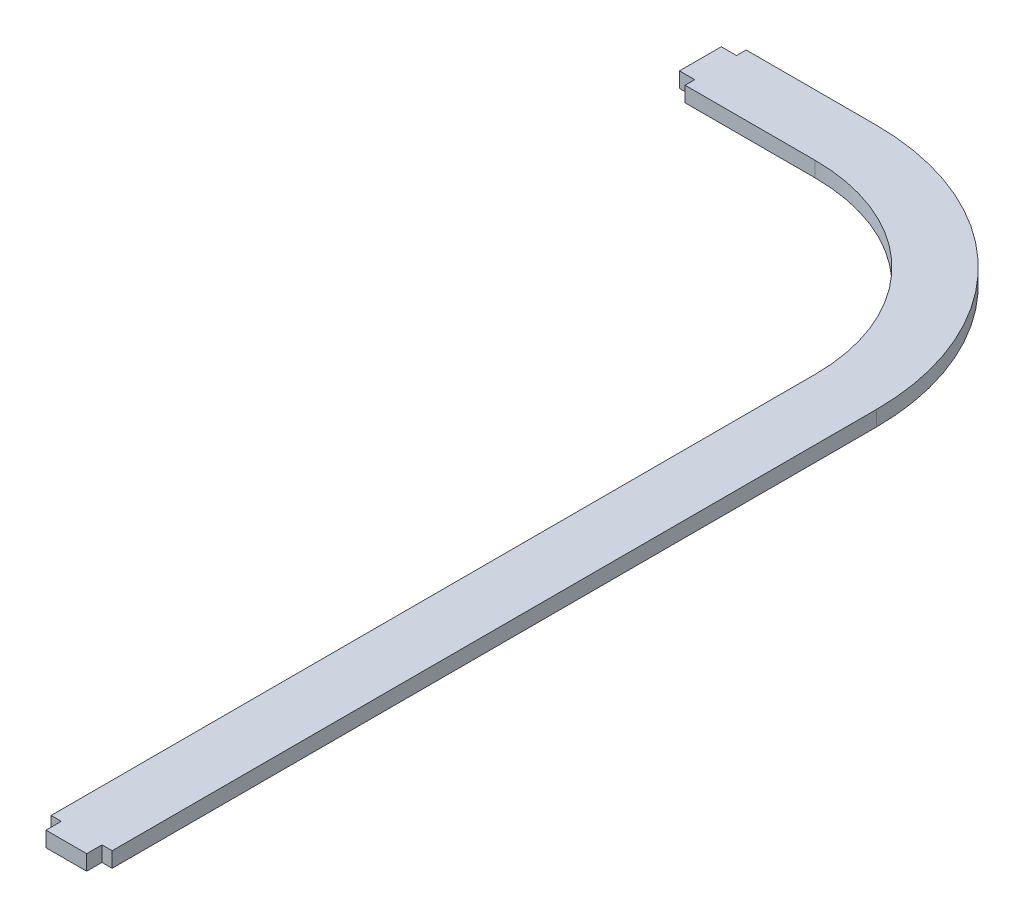
ISO-10303-21;
HEADER;
FILE_DESCRIPTION(('STEP AP214'),'2;1');
FILE_NAME('part.step','',(''),(''),'','','');
FILE_SCHEMA(('AUTOMOTIVE_DESIGN { 1 0 10303 214 1 1 1 1 }'));
ENDSEC;
DATA;
#1=APPLICATION_CONTEXT('core data for automotive mechanical design processes');
#2=APPLICATION_PROTOCOL_DEFINITION('international standard','automotive_design',2000,#1);
#3=PRODUCT_CONTEXT('',#1,'mechanical');
#4=PRODUCT('Part','Part','',(#3));
#5=PRODUCT_RELATED_PRODUCT_CATEGORY('part','',(#4));
#6=PRODUCT_DEFINITION_FORMATION('','',#4);
#7=PRODUCT_DEFINITION_CONTEXT('part definition',#1,'design');
#8=PRODUCT_DEFINITION('design','',#6,#7);
#9=PRODUCT_DEFINITION_SHAPE('','',#8);
#10=(LENGTH_UNIT() NAMED_UNIT(*) SI_UNIT(.MILLI.,.METRE.));
#11=(NAMED_UNIT(*) PLANE_ANGLE_UNIT() SI_UNIT($,.RADIAN.));
#12=(NAMED_UNIT(*) SI_UNIT($,.STERADIAN.) SOLID_ANGLE_UNIT());
#13=UNCERTAINTY_MEASURE_WITH_UNIT(LENGTH_MEASURE(1.E-05),#10,'distance_accuracy_value','');
#14=(GEOMETRIC_REPRESENTATION_CONTEXT(3) GLOBAL_UNCERTAINTY_ASSIGNED_CONTEXT((#13)) GLOBAL_UNIT_ASSIGNED_CONTEXT((#10,
#11,#12)) REPRESENTATION_CONTEXT('',''));
#15=CARTESIAN_POINT('',(0.,0.,0.));
#16=DIRECTION('',(0.,0.,1.));
#17=DIRECTION('',(1.,0.,0.));
#18=AXIS2_PLACEMENT_3D('',#15,#16,#17);
#19=CARTESIAN_POINT('',(77.,3.,0.));
#20=DIRECTION('',(-1.,0.,0.));
#21=DIRECTION('',(0.,0.,1.));
#22=AXIS2_PLACEMENT_3D('',#19,#20,#21);
#23=PLANE('',#22);
#24=DIRECTION('',(0.,0.,-1.));
#25=VECTOR('',#24,1.);
#26=CARTESIAN_POINT('',(77.,0.,0.));
#27=LINE('',#26,#25);
#28=CARTESIAN_POINT('',(77.,0.,188.736951871658));
#29=VERTEX_POINT('',#28);
#30=CARTESIAN_POINT('',(77.,0.,38.5333587428506));
#31=VERTEX_POINT('',#30);
#32=EDGE_CURVE('E180',#29,#31,#27,.T.);
#33=ORIENTED_EDGE('',*,*,#32,.T.);
#34=DIRECTION('',(0.,-1.,0.));
#35=VECTOR('',#34,1.);
#36=CARTESIAN_POINT('',(77.,3.,38.5333587428506));
#37=LINE('',#36,#35);
#38=CARTESIAN_POINT('',(77.,3.,38.5333587428506));
#39=VERTEX_POINT('',#38);
#40=EDGE_CURVE('E11',#39,#31,#37,.T.);
#41=ORIENTED_EDGE('',*,*,#40,.F.);
#42=DIRECTION('',(0.,0.,-1.));
#43=VECTOR('',#42,1.);
#44=CARTESIAN_POINT('',(77.,3.,0.));
#45=LINE('',#44,#43);
#46=CARTESIAN_POINT('',(77.,3.,188.736951871658));
#47=VERTEX_POINT('',#46);
#48=EDGE_CURVE('E222',#47,#39,#45,.T.);
#49=ORIENTED_EDGE('',*,*,#48,.F.);
#50=DIRECTION('',(0.,-1.,0.));
#51=VECTOR('',#50,1.);
#52=CARTESIAN_POINT('',(77.,3.,188.736951871658));
#53=LINE('',#52,#51);
#54=EDGE_CURVE('E179',#47,#29,#53,.T.);
#55=ORIENTED_EDGE('',*,*,#54,.T.);
#56=EDGE_LOOP('',(#33,#41,#49,#55));
#57=FACE_BOUND('',#56,.T.);
#58=ADVANCED_FACE('F35',(#57),#23,.F.);
#59=CARTESIAN_POINT('',(28.5735931288072,3.,38.5333587428506));
#60=DIRECTION('',(0.,-1.,0.));
#61=DIRECTION('',(0.,0.,-1.));
#62=AXIS2_PLACEMENT_3D('',#59,#60,#61);
#63=CYLINDRICAL_SURFACE('',#62,48.4264068711928);
#64=CARTESIAN_POINT('',(28.5735931288072,0.,38.5333587428506));
#65=DIRECTION('',(0.,1.,0.));
#66=DIRECTION('',(0.,0.,1.));
#67=AXIS2_PLACEMENT_3D('',#64,#65,#66);
#68=CIRCLE('',#67,48.4264068711928);
#69=CARTESIAN_POINT('',(28.5735931288072,0.,-9.89304812834225));
#70=VERTEX_POINT('',#69);
#71=EDGE_CURVE('E183',#31,#70,#68,.T.);
#72=ORIENTED_EDGE('',*,*,#71,.T.);
#73=DIRECTION('',(0.,-1.,0.));
#74=VECTOR('',#73,1.);
#75=CARTESIAN_POINT('',(28.5735931288072,3.,-9.89304812834225));
#76=LINE('',#75,#74);
#77=CARTESIAN_POINT('',(28.5735931288072,3.,-9.89304812834225));
#78=VERTEX_POINT('',#77);
#79=EDGE_CURVE('E43',#78,#70,#76,.T.);
#80=ORIENTED_EDGE('',*,*,#79,.F.);
#81=CARTESIAN_POINT('',(28.5735931288072,3.,38.5333587428506));
#82=DIRECTION('',(0.,1.,0.));
#83=DIRECTION('',(0.,0.,1.));
#84=AXIS2_PLACEMENT_3D('',#81,#82,#83);
#85=CIRCLE('',#84,48.4264068711928);
#86=EDGE_CURVE('E117',#39,#78,#85,.T.);
#87=ORIENTED_EDGE('',*,*,#86,.F.);
#88=ORIENTED_EDGE('',*,*,#40,.T.);
#89=EDGE_LOOP('',(#72,#80,#87,#88));
#90=FACE_BOUND('',#89,.T.);
#91=ADVANCED_FACE('F251',(#90),#63,.T.);
#92=CARTESIAN_POINT('',(0.,3.,-9.89304812834225));
#93=DIRECTION('',(0.,0.,-1.));
#94=DIRECTION('',(-1.,0.,0.));
#95=AXIS2_PLACEMENT_3D('',#92,#93,#94);
#96=PLANE('',#95);
#97=DIRECTION('',(1.,0.,0.));
#98=VECTOR('',#97,1.);
#99=CARTESIAN_POINT('',(0.,0.,-9.89304812834225));
#100=LINE('',#99,#98);
#101=CARTESIAN_POINT('',(3.,0.,-9.89304812834225));
#102=VERTEX_POINT('',#101);
#103=EDGE_CURVE('E186',#102,#70,#100,.T.);
#104=ORIENTED_EDGE('',*,*,#103,.F.);
#105=DIRECTION('',(0.,-1.,0.));
#106=VECTOR('',#105,1.);
#107=CARTESIAN_POINT('',(3.,3.,-9.89304812834225));
#108=LINE('',#107,#106);
#109=CARTESIAN_POINT('',(3.,3.,-9.89304812834225));
#110=VERTEX_POINT('',#109);
#111=EDGE_CURVE('E244',#110,#102,#108,.T.);
#112=ORIENTED_EDGE('',*,*,#111,.F.);
#113=DIRECTION('',(1.,0.,0.));
#114=VECTOR('',#113,1.);
#115=CARTESIAN_POINT('',(0.,3.,-9.89304812834225));
#116=LINE('',#115,#114);
#117=EDGE_CURVE('E250',#110,#78,#116,.T.);
#118=ORIENTED_EDGE('',*,*,#117,.T.);
#119=ORIENTED_EDGE('',*,*,#79,.T.);
#120=EDGE_LOOP('',(#104,#112,#118,#119));
#121=FACE_BOUND('',#120,.T.);
#122=ADVANCED_FACE('F248',(#121),#96,.T.);
#123=CARTESIAN_POINT('',(3.,3.,0.));
#124=DIRECTION('',(-1.,0.,0.));
#125=DIRECTION('',(0.,0.,1.));
#126=AXIS2_PLACEMENT_3D('',#123,#124,#125);
#127=PLANE('',#126);
#128=DIRECTION('',(0.,0.,-1.));
#129=VECTOR('',#128,1.);
#130=CARTESIAN_POINT('',(3.,0.,0.));
#131=LINE('',#130,#129);
#132=CARTESIAN_POINT('',(3.,0.,-8.));
#133=VERTEX_POINT('',#132);
#134=EDGE_CURVE('E189',#133,#102,#131,.T.);
#135=ORIENTED_EDGE('',*,*,#134,.F.);
#136=DIRECTION('',(0.,-1.,0.));
#137=VECTOR('',#136,1.);
#138=CARTESIAN_POINT('',(3.,3.,-8.));
#139=LINE('',#138,#137);
#140=CARTESIAN_POINT('',(3.,3.,-8.));
#141=VERTEX_POINT('',#140);
#142=EDGE_CURVE('E242',#141,#133,#139,.T.);
#143=ORIENTED_EDGE('',*,*,#142,.F.);
#144=DIRECTION('',(0.,0.,-1.));
#145=VECTOR('',#144,1.);
#146=CARTESIAN_POINT('',(3.,3.,0.));
#147=LINE('',#146,#145);
#148=EDGE_CURVE('E262',#141,#110,#147,.T.);
#149=ORIENTED_EDGE('',*,*,#148,.T.);
#150=ORIENTED_EDGE('',*,*,#111,.T.);
#151=EDGE_LOOP('',(#135,#143,#149,#150));
#152=FACE_BOUND('',#151,.T.);
#153=ADVANCED_FACE('F259',(#152),#127,.T.);
#154=CARTESIAN_POINT('',(0.,3.,-8.));
#155=DIRECTION('',(0.,0.,-1.));
#156=DIRECTION('',(-1.,0.,0.));
#157=AXIS2_PLACEMENT_3D('',#154,#155,#156);
#158=PLANE('',#157);
#159=DIRECTION('',(1.,0.,0.));
#160=VECTOR('',#159,1.);
#161=CARTESIAN_POINT('',(0.,0.,-8.));
#162=LINE('',#161,#160);
#163=CARTESIAN_POINT('',(0.,0.,-8.));
#164=VERTEX_POINT('',#163);
#165=EDGE_CURVE('E192',#164,#133,#162,.T.);
#166=ORIENTED_EDGE('',*,*,#165,.F.);
#167=DIRECTION('',(0.,-1.,0.));
#168=VECTOR('',#167,1.);
#169=CARTESIAN_POINT('',(0.,3.,-8.));
#170=LINE('',#169,#168);
#171=CARTESIAN_POINT('',(0.,3.,-8.));
#172=VERTEX_POINT('',#171);
#173=EDGE_CURVE('E240',#172,#164,#170,.T.);
#174=ORIENTED_EDGE('',*,*,#173,.F.);
#175=DIRECTION('',(1.,0.,0.));
#176=VECTOR('',#175,1.);
#177=CARTESIAN_POINT('',(0.,3.,-8.));
#178=LINE('',#177,#176);
#179=EDGE_CURVE('E266',#172,#141,#178,.T.);
#180=ORIENTED_EDGE('',*,*,#179,.T.);
#181=ORIENTED_EDGE('',*,*,#142,.T.);
#182=EDGE_LOOP('',(#166,#174,#180,#181));
#183=FACE_BOUND('',#182,.T.);
#184=ADVANCED_FACE('F320',(#183),#158,.T.);
#185=CARTESIAN_POINT('',(0.,3.,0.));
#186=DIRECTION('',(-1.,0.,0.));
#187=DIRECTION('',(0.,0.,1.));
#188=AXIS2_PLACEMENT_3D('',#185,#186,#187);
#189=PLANE('',#188);
#190=DIRECTION('',(0.,0.,-1.));
#191=VECTOR('',#190,1.);
#192=CARTESIAN_POINT('',(0.,0.,0.));
#193=LINE('',#192,#191);
#194=CARTESIAN_POINT('',(0.,0.,0.213903743315501));
#195=VERTEX_POINT('',#194);
#196=EDGE_CURVE('E195',#195,#164,#193,.T.);
#197=ORIENTED_EDGE('',*,*,#196,.F.);
#198=DIRECTION('',(0.,-1.,0.));
#199=VECTOR('',#198,1.);
#200=CARTESIAN_POINT('',(0.,3.,0.213903743315501));
#201=LINE('',#200,#199);
#202=CARTESIAN_POINT('',(0.,3.,0.213903743315501));
#203=VERTEX_POINT('',#202);
#204=EDGE_CURVE('E238',#203,#195,#201,.T.);
#205=ORIENTED_EDGE('',*,*,#204,.F.);
#206=DIRECTION('',(0.,0.,-1.));
#207=VECTOR('',#206,1.);
#208=CARTESIAN_POINT('',(0.,3.,0.));
#209=LINE('',#208,#207);
#210=EDGE_CURVE('E272',#203,#172,#209,.T.);
#211=ORIENTED_EDGE('',*,*,#210,.T.);
#212=ORIENTED_EDGE('',*,*,#173,.T.);
#213=EDGE_LOOP('',(#197,#205,#211,#212));
#214=FACE_BOUND('',#213,.T.);
#215=ADVANCED_FACE('F323',(#214),#189,.T.);
#216=CARTESIAN_POINT('',(0.,3.,0.213903743315501));
#217=DIRECTION('',(0.,0.,-1.));
#218=DIRECTION('',(-1.,0.,0.));
#219=AXIS2_PLACEMENT_3D('',#216,#217,#218);
#220=PLANE('',#219);
#221=DIRECTION('',(1.,0.,0.));
#222=VECTOR('',#221,1.);
#223=CARTESIAN_POINT('',(0.,0.,0.213903743315501));
#224=LINE('',#223,#222);
#225=CARTESIAN_POINT('',(3.,0.,0.213903743315501));
#226=VERTEX_POINT('',#225);
#227=EDGE_CURVE('E198',#195,#226,#224,.T.);
#228=ORIENTED_EDGE('',*,*,#227,.T.);
#229=DIRECTION('',(0.,-1.,0.));
#230=VECTOR('',#229,1.);
#231=CARTESIAN_POINT('',(3.,3.,0.213903743315501));
#232=LINE('',#231,#230);
#233=CARTESIAN_POINT('',(3.,3.,0.213903743315501));
#234=VERTEX_POINT('',#233);
#235=EDGE_CURVE('E236',#234,#226,#232,.T.);
#236=ORIENTED_EDGE('',*,*,#235,.F.);
#237=DIRECTION('',(1.,0.,0.));
#238=VECTOR('',#237,1.);
#239=CARTESIAN_POINT('',(0.,3.,0.213903743315501));
#240=LINE('',#239,#238);
#241=EDGE_CURVE('E275',#203,#234,#240,.T.);
#242=ORIENTED_EDGE('',*,*,#241,.F.);
#243=ORIENTED_EDGE('',*,*,#204,.T.);
#244=EDGE_LOOP('',(#228,#236,#242,#243));
#245=FACE_BOUND('',#244,.T.);
#246=ADVANCED_FACE('F327',(#245),#220,.F.);
#247=CARTESIAN_POINT('',(3.,3.,0.));
#248=DIRECTION('',(-1.,0.,0.));
#249=DIRECTION('',(0.,0.,1.));
#250=AXIS2_PLACEMENT_3D('',#247,#248,#249);
#251=PLANE('',#250);
#252=DIRECTION('',(0.,0.,-1.));
#253=VECTOR('',#252,1.);
#254=CARTESIAN_POINT('',(3.,0.,0.));
#255=LINE('',#254,#253);
#256=CARTESIAN_POINT('',(3.,0.,2.10695187165775));
#257=VERTEX_POINT('',#256);
#258=EDGE_CURVE('E201',#257,#226,#255,.T.);
#259=ORIENTED_EDGE('',*,*,#258,.F.);
#260=DIRECTION('',(0.,-1.,0.));
#261=VECTOR('',#260,1.);
#262=CARTESIAN_POINT('',(3.,3.,2.10695187165775));
#263=LINE('',#262,#261);
#264=CARTESIAN_POINT('',(3.,3.,2.10695187165775));
#265=VERTEX_POINT('',#264);
#266=EDGE_CURVE('E234',#265,#257,#263,.T.);
#267=ORIENTED_EDGE('',*,*,#266,.F.);
#268=DIRECTION('',(0.,0.,-1.));
#269=VECTOR('',#268,1.);
#270=CARTESIAN_POINT('',(3.,3.,0.));
#271=LINE('',#270,#269);
#272=EDGE_CURVE('E277',#265,#234,#271,.T.);
#273=ORIENTED_EDGE('',*,*,#272,.T.);
#274=ORIENTED_EDGE('',*,*,#235,.T.);
#275=EDGE_LOOP('',(#259,#267,#273,#274));
#276=FACE_BOUND('',#275,.T.);
#277=ADVANCED_FACE('F331',(#276),#251,.T.);
#278=CARTESIAN_POINT('',(0.,3.,2.10695187165775));
#279=DIRECTION('',(0.,0.,-1.));
#280=DIRECTION('',(-1.,0.,0.));
#281=AXIS2_PLACEMENT_3D('',#278,#279,#280);
#282=PLANE('',#281);
#283=DIRECTION('',(1.,0.,0.));
#284=VECTOR('',#283,1.);
#285=CARTESIAN_POINT('',(0.,0.,2.10695187165775));
#286=LINE('',#285,#284);
#287=CARTESIAN_POINT('',(28.5735931288072,0.,2.10695187165775));
#288=VERTEX_POINT('',#287);
#289=EDGE_CURVE('E204',#257,#288,#286,.T.);
#290=ORIENTED_EDGE('',*,*,#289,.T.);
#291=DIRECTION('',(0.,-1.,0.));
#292=VECTOR('',#291,1.);
#293=CARTESIAN_POINT('',(28.5735931288072,3.,2.10695187165775));
#294=LINE('',#293,#292);
#295=CARTESIAN_POINT('',(28.5735931288072,3.,2.10695187165775));
#296=VERTEX_POINT('',#295);
#297=EDGE_CURVE('E232',#296,#288,#294,.T.);
#298=ORIENTED_EDGE('',*,*,#297,.F.);
#299=DIRECTION('',(1.,0.,0.));
#300=VECTOR('',#299,1.);
#301=CARTESIAN_POINT('',(0.,3.,2.10695187165775));
#302=LINE('',#301,#300);
#303=EDGE_CURVE('E280',#265,#296,#302,.T.);
#304=ORIENTED_EDGE('',*,*,#303,.F.);
#305=ORIENTED_EDGE('',*,*,#266,.T.);
#306=EDGE_LOOP('',(#290,#298,#304,#305));
#307=FACE_BOUND('',#306,.T.);
#308=ADVANCED_FACE('F335',(#307),#282,.F.);
#309=CARTESIAN_POINT('',(28.5735931288072,3.,38.5333587428506));
#310=DIRECTION('',(0.,-1.,0.));
#311=DIRECTION('',(0.,0.,-1.));
#312=AXIS2_PLACEMENT_3D('',#309,#310,#311);
#313=CYLINDRICAL_SURFACE('',#312,36.4264068711928);
#314=CARTESIAN_POINT('',(28.5735931288072,0.,38.5333587428506));
#315=DIRECTION('',(0.,1.,0.));
#316=DIRECTION('',(0.,0.,1.));
#317=AXIS2_PLACEMENT_3D('',#314,#315,#316);
#318=CIRCLE('',#317,36.4264068711928);
#319=CARTESIAN_POINT('',(65.,0.,38.5333587428506));
#320=VERTEX_POINT('',#319);
#321=EDGE_CURVE('E207',#320,#288,#318,.T.);
#322=ORIENTED_EDGE('',*,*,#321,.F.);
#323=DIRECTION('',(0.,-1.,0.));
#324=VECTOR('',#323,1.);
#325=CARTESIAN_POINT('',(65.,3.,38.5333587428506));
#326=LINE('',#325,#324);
#327=CARTESIAN_POINT('',(65.,3.,38.5333587428506));
#328=VERTEX_POINT('',#327);
#329=EDGE_CURVE('E230',#328,#320,#326,.T.);
#330=ORIENTED_EDGE('',*,*,#329,.F.);
#331=CARTESIAN_POINT('',(28.5735931288072,3.,38.5333587428506));
#332=DIRECTION('',(0.,1.,0.));
#333=DIRECTION('',(0.,0.,1.));
#334=AXIS2_PLACEMENT_3D('',#331,#332,#333);
#335=CIRCLE('',#334,36.4264068711928);
#336=EDGE_CURVE('E282',#328,#296,#335,.T.);
#337=ORIENTED_EDGE('',*,*,#336,.T.);
#338=ORIENTED_EDGE('',*,*,#297,.T.);
#339=EDGE_LOOP('',(#322,#330,#337,#338));
#340=FACE_BOUND('',#339,.T.);
#341=ADVANCED_FACE('F339',(#340),#313,.F.);
#342=CARTESIAN_POINT('',(65.,3.,0.));
#343=DIRECTION('',(-1.,0.,0.));
#344=DIRECTION('',(0.,0.,1.));
#345=AXIS2_PLACEMENT_3D('',#342,#343,#344);
#346=PLANE('',#345);
#347=DIRECTION('',(0.,0.,-1.));
#348=VECTOR('',#347,1.);
#349=CARTESIAN_POINT('',(65.,0.,0.));
#350=LINE('',#349,#348);
#351=CARTESIAN_POINT('',(65.,0.,188.736951871658));
#352=VERTEX_POINT('',#351);
#353=EDGE_CURVE('E210',#352,#320,#350,.T.);
#354=ORIENTED_EDGE('',*,*,#353,.F.);
#355=DIRECTION('',(0.,-1.,0.));
#356=VECTOR('',#355,1.);
#357=CARTESIAN_POINT('',(65.,3.,188.736951871658));
#358=LINE('',#357,#356);
#359=CARTESIAN_POINT('',(65.,3.,188.736951871658));
#360=VERTEX_POINT('',#359);
#361=EDGE_CURVE('E228',#360,#352,#358,.T.);
#362=ORIENTED_EDGE('',*,*,#361,.F.);
#363=DIRECTION('',(0.,0.,-1.));
#364=VECTOR('',#363,1.);
#365=CARTESIAN_POINT('',(65.,3.,0.));
#366=LINE('',#365,#364);
#367=EDGE_CURVE('E285',#360,#328,#366,.T.);
#368=ORIENTED_EDGE('',*,*,#367,.T.);
#369=ORIENTED_EDGE('',*,*,#329,.T.);
#370=EDGE_LOOP('',(#354,#362,#368,#369));
#371=FACE_BOUND('',#370,.T.);
#372=ADVANCED_FACE('F343',(#371),#346,.T.);
#373=CARTESIAN_POINT('',(0.,3.,188.736951871658));
#374=DIRECTION('',(0.,0.,-1.));
#375=DIRECTION('',(-1.,0.,0.));
#376=AXIS2_PLACEMENT_3D('',#373,#374,#375);
#377=PLANE('',#376);
#378=DIRECTION('',(1.,0.,0.));
#379=VECTOR('',#378,1.);
#380=CARTESIAN_POINT('',(0.,0.,188.736951871658));
#381=LINE('',#380,#379);
#382=CARTESIAN_POINT('',(67.,0.,188.736951871658));
#383=VERTEX_POINT('',#382);
#384=EDGE_CURVE('E213',#352,#383,#381,.T.);
#385=ORIENTED_EDGE('',*,*,#384,.T.);
#386=DIRECTION('',(0.,-1.,0.));
#387=VECTOR('',#386,1.);
#388=CARTESIAN_POINT('',(67.,3.,188.736951871658));
#389=LINE('',#388,#387);
#390=CARTESIAN_POINT('',(67.,3.,188.736951871658));
#391=VERTEX_POINT('',#390);
#392=EDGE_CURVE('E226',#391,#383,#389,.T.);
#393=ORIENTED_EDGE('',*,*,#392,.F.);
#394=DIRECTION('',(1.,0.,0.));
#395=VECTOR('',#394,1.);
#396=CARTESIAN_POINT('',(0.,3.,188.736951871658));
#397=LINE('',#396,#395);
#398=EDGE_CURVE('E174',#360,#391,#397,.T.);
#399=ORIENTED_EDGE('',*,*,#398,.F.);
#400=ORIENTED_EDGE('',*,*,#361,.T.);
#401=EDGE_LOOP('',(#385,#393,#399,#400));
#402=FACE_BOUND('',#401,.T.);
#403=ADVANCED_FACE('F292',(#402),#377,.F.);
#404=CARTESIAN_POINT('',(67.,3.,0.));
#405=DIRECTION('',(-1.,0.,0.));
#406=DIRECTION('',(0.,0.,1.));
#407=AXIS2_PLACEMENT_3D('',#404,#405,#406);
#408=PLANE('',#407);
#409=DIRECTION('',(0.,0.,-1.));
#410=VECTOR('',#409,1.);
#411=CARTESIAN_POINT('',(67.,0.,0.));
#412=LINE('',#411,#410);
#413=CARTESIAN_POINT('',(67.,0.,191.736951871658));
#414=VERTEX_POINT('',#413);
#415=EDGE_CURVE('E216',#414,#383,#412,.T.);
#416=ORIENTED_EDGE('',*,*,#415,.F.);
#417=DIRECTION('',(0.,-1.,0.));
#418=VECTOR('',#417,1.);
#419=CARTESIAN_POINT('',(67.,3.,191.736951871658));
#420=LINE('',#419,#418);
#421=CARTESIAN_POINT('',(67.,3.,191.736951871658));
#422=VERTEX_POINT('',#421);
#423=EDGE_CURVE('E163',#422,#414,#420,.T.);
#424=ORIENTED_EDGE('',*,*,#423,.F.);
#425=DIRECTION('',(0.,0.,-1.));
#426=VECTOR('',#425,1.);
#427=CARTESIAN_POINT('',(67.,3.,0.));
#428=LINE('',#427,#426);
#429=EDGE_CURVE('E172',#422,#391,#428,.T.);
#430=ORIENTED_EDGE('',*,*,#429,.T.);
#431=ORIENTED_EDGE('',*,*,#392,.T.);
#432=EDGE_LOOP('',(#416,#424,#430,#431));
#433=FACE_BOUND('',#432,.T.);
#434=ADVANCED_FACE('F296',(#433),#408,.T.);
#435=CARTESIAN_POINT('',(6.65221183248E-13,3.,191.736951871658));
#436=DIRECTION('',(0.,0.,1.));
#437=DIRECTION('',(1.,0.,0.));
#438=AXIS2_PLACEMENT_3D('',#435,#436,#437);
#439=PLANE('',#438);
#440=DIRECTION('',(-1.,0.,0.));
#441=VECTOR('',#440,1.);
#442=CARTESIAN_POINT('',(6.65221183248E-13,0.,191.736951871658));
#443=LINE('',#442,#441);
#444=CARTESIAN_POINT('',(75.,0.,191.736951871658));
#445=VERTEX_POINT('',#444);
#446=EDGE_CURVE('E162',#445,#414,#443,.T.);
#447=ORIENTED_EDGE('',*,*,#446,.F.);
#448=DIRECTION('',(0.,-1.,0.));
#449=VECTOR('',#448,1.);
#450=CARTESIAN_POINT('',(75.,3.,191.736951871658));
#451=LINE('',#450,#449);
#452=CARTESIAN_POINT('',(75.,3.,191.736951871658));
#453=VERTEX_POINT('',#452);
#454=EDGE_CURVE('E156',#453,#445,#451,.T.);
#455=ORIENTED_EDGE('',*,*,#454,.F.);
#456=DIRECTION('',(-1.,0.,0.));
#457=VECTOR('',#456,1.);
#458=CARTESIAN_POINT('',(6.65221183248E-13,3.,191.736951871658));
#459=LINE('',#458,#457);
#460=EDGE_CURVE('E160',#453,#422,#459,.T.);
#461=ORIENTED_EDGE('',*,*,#460,.T.);
#462=ORIENTED_EDGE('',*,*,#423,.T.);
#463=EDGE_LOOP('',(#447,#455,#461,#462));
#464=FACE_BOUND('',#463,.T.);
#465=ADVANCED_FACE('F158',(#464),#439,.T.);
#466=CARTESIAN_POINT('',(74.9999999999983,3.,-6.93889390390706E-13));
#467=DIRECTION('',(-1.,0.,0.));
#468=DIRECTION('',(0.,0.,1.));
#469=AXIS2_PLACEMENT_3D('',#466,#467,#468);
#470=PLANE('',#469);
#471=DIRECTION('',(0.,0.,-1.));
#472=VECTOR('',#471,1.);
#473=CARTESIAN_POINT('',(74.9999999999983,0.,-6.93889390390706E-13));
#474=LINE('',#473,#472);
#475=CARTESIAN_POINT('',(75.,0.,188.736951871658));
#476=VERTEX_POINT('',#475);
#477=EDGE_CURVE('E103',#445,#476,#474,.T.);
#478=ORIENTED_EDGE('',*,*,#477,.T.);
#479=DIRECTION('',(0.,-1.,0.));
#480=VECTOR('',#479,1.);
#481=CARTESIAN_POINT('',(75.,3.,188.736951871658));
#482=LINE('',#481,#480);
#483=CARTESIAN_POINT('',(75.,3.,188.736951871658));
#484=VERTEX_POINT('',#483);
#485=EDGE_CURVE('E164',#484,#476,#482,.T.);
#486=ORIENTED_EDGE('',*,*,#485,.F.);
#487=DIRECTION('',(0.,0.,-1.));
#488=VECTOR('',#487,1.);
#489=CARTESIAN_POINT('',(74.9999999999983,3.,-6.93889390390706E-13));
#490=LINE('',#489,#488);
#491=EDGE_CURVE('E166',#453,#484,#490,.T.);
#492=ORIENTED_EDGE('',*,*,#491,.F.);
#493=ORIENTED_EDGE('',*,*,#454,.T.);
#494=EDGE_LOOP('',(#478,#486,#492,#493));
#495=FACE_BOUND('',#494,.T.);
#496=ADVANCED_FACE('F167',(#495),#470,.F.);
#497=CARTESIAN_POINT('',(-2.61925136956852E-12,3.,188.736951871657));
#498=DIRECTION('',(0.,0.,-1.));
#499=DIRECTION('',(-1.,0.,0.));
#500=AXIS2_PLACEMENT_3D('',#497,#498,#499);
#501=PLANE('',#500);
#502=DIRECTION('',(1.,0.,0.));
#503=VECTOR('',#502,1.);
#504=CARTESIAN_POINT('',(-2.61925136956852E-12,0.,188.736951871657));
#505=LINE('',#504,#503);
#506=EDGE_CURVE('E109',#476,#29,#505,.T.);
#507=ORIENTED_EDGE('',*,*,#506,.T.);
#508=ORIENTED_EDGE('',*,*,#54,.F.);
#509=DIRECTION('',(1.,0.,0.));
#510=VECTOR('',#509,1.);
#511=CARTESIAN_POINT('',(-2.61925136956852E-12,3.,188.736951871657));
#512=LINE('',#511,#510);
#513=EDGE_CURVE('E51',#484,#47,#512,.T.);
#514=ORIENTED_EDGE('',*,*,#513,.F.);
#515=ORIENTED_EDGE('',*,*,#485,.T.);
#516=EDGE_LOOP('',(#507,#508,#514,#515));
#517=FACE_BOUND('',#516,.T.);
#518=ADVANCED_FACE('F299',(#517),#501,.F.);
#519=CARTESIAN_POINT('',(0.,3.,0.));
#520=DIRECTION('',(0.,1.,0.));
#521=DIRECTION('',(0.,0.,1.));
#522=AXIS2_PLACEMENT_3D('',#519,#520,#521);
#523=PLANE('',#522);
#524=ORIENTED_EDGE('',*,*,#48,.T.);
#525=ORIENTED_EDGE('',*,*,#86,.T.);
#526=ORIENTED_EDGE('',*,*,#117,.F.);
#527=ORIENTED_EDGE('',*,*,#148,.F.);
#528=ORIENTED_EDGE('',*,*,#179,.F.);
#529=ORIENTED_EDGE('',*,*,#210,.F.);
#530=ORIENTED_EDGE('',*,*,#241,.T.);
#531=ORIENTED_EDGE('',*,*,#272,.F.);
#532=ORIENTED_EDGE('',*,*,#303,.T.);
#533=ORIENTED_EDGE('',*,*,#336,.F.);
#534=ORIENTED_EDGE('',*,*,#367,.F.);
#535=ORIENTED_EDGE('',*,*,#398,.T.);
#536=ORIENTED_EDGE('',*,*,#429,.F.);
#537=ORIENTED_EDGE('',*,*,#460,.F.);
#538=ORIENTED_EDGE('',*,*,#491,.T.);
#539=ORIENTED_EDGE('',*,*,#513,.T.);
#540=EDGE_LOOP('',(#524,#525,#526,#527,#528,#529,#530,#531,#532,#533,#534,#535,#536,#537,#538,#539));
#541=FACE_BOUND('',#540,.T.);
#542=ADVANCED_FACE('F170',(#541),#523,.T.);
#543=CARTESIAN_POINT('',(0.,0.,0.));
#544=DIRECTION('',(0.,1.,0.));
#545=DIRECTION('',(0.,0.,1.));
#546=AXIS2_PLACEMENT_3D('',#543,#544,#545);
#547=PLANE('',#546);
#548=ORIENTED_EDGE('',*,*,#32,.F.);
#549=ORIENTED_EDGE('',*,*,#506,.F.);
#550=ORIENTED_EDGE('',*,*,#477,.F.);
#551=ORIENTED_EDGE('',*,*,#446,.T.);
#552=ORIENTED_EDGE('',*,*,#415,.T.);
#553=ORIENTED_EDGE('',*,*,#384,.F.);
#554=ORIENTED_EDGE('',*,*,#353,.T.);
#555=ORIENTED_EDGE('',*,*,#321,.T.);
#556=ORIENTED_EDGE('',*,*,#289,.F.);
#557=ORIENTED_EDGE('',*,*,#258,.T.);
#558=ORIENTED_EDGE('',*,*,#227,.F.);
#559=ORIENTED_EDGE('',*,*,#196,.T.);
#560=ORIENTED_EDGE('',*,*,#165,.T.);
#561=ORIENTED_EDGE('',*,*,#134,.T.);
#562=ORIENTED_EDGE('',*,*,#103,.T.);
#563=ORIENTED_EDGE('',*,*,#71,.F.);
#564=EDGE_LOOP('',(#548,#549,#550,#551,#552,#553,#554,#555,#556,#557,#558,#559,#560,#561,#562,#563));
#565=FACE_BOUND('',#564,.T.);
#566=ADVANCED_FACE('F255',(#565),#547,.F.);
#567=CLOSED_SHELL('',(#58,#91,#122,#153,#184,#215,#246,#277,#308,#341,#372,#403,#434,#465,#496,
#518,#542,#566));
#568=MANIFOLD_SOLID_BREP('B2',#567);
#569=ADVANCED_BREP_SHAPE_REPRESENTATION('',(#18,#568),#14);
#570=SHAPE_DEFINITION_REPRESENTATION(#9,#569);
ENDSEC;
END-ISO-10303-21;
